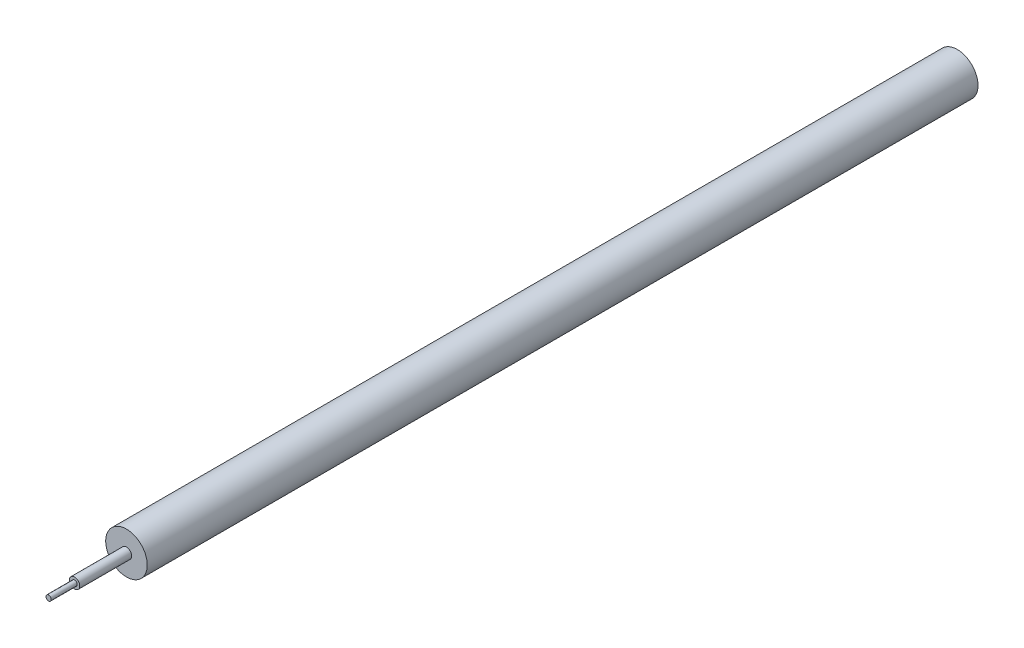
ISO-10303-21;
HEADER;
FILE_DESCRIPTION(('STEP AP214'),'2;1');
FILE_NAME('part.step','',(''),(''),'','','');
FILE_SCHEMA(('AUTOMOTIVE_DESIGN { 1 0 10303 214 1 1 1 1 }'));
ENDSEC;
DATA;
#1=APPLICATION_CONTEXT('core data for automotive mechanical design processes');
#2=APPLICATION_PROTOCOL_DEFINITION('international standard','automotive_design',2000,#1);
#3=PRODUCT_CONTEXT('',#1,'mechanical');
#4=PRODUCT('Part','Part','',(#3));
#5=PRODUCT_RELATED_PRODUCT_CATEGORY('part','',(#4));
#6=PRODUCT_DEFINITION_FORMATION('','',#4);
#7=PRODUCT_DEFINITION_CONTEXT('part definition',#1,'design');
#8=PRODUCT_DEFINITION('design','',#6,#7);
#9=PRODUCT_DEFINITION_SHAPE('','',#8);
#10=(LENGTH_UNIT() NAMED_UNIT(*) SI_UNIT(.MILLI.,.METRE.));
#11=(NAMED_UNIT(*) PLANE_ANGLE_UNIT() SI_UNIT($,.RADIAN.));
#12=(NAMED_UNIT(*) SI_UNIT($,.STERADIAN.) SOLID_ANGLE_UNIT());
#13=UNCERTAINTY_MEASURE_WITH_UNIT(LENGTH_MEASURE(1.E-05),#10,'distance_accuracy_value','');
#14=(GEOMETRIC_REPRESENTATION_CONTEXT(3) GLOBAL_UNCERTAINTY_ASSIGNED_CONTEXT((#13)) GLOBAL_UNIT_ASSIGNED_CONTEXT((#10,
#11,#12)) REPRESENTATION_CONTEXT('',''));
#15=CARTESIAN_POINT('',(0.,0.,0.));
#16=DIRECTION('',(0.,0.,1.));
#17=DIRECTION('',(1.,0.,0.));
#18=AXIS2_PLACEMENT_3D('',#15,#16,#17);
#19=CARTESIAN_POINT('',(4.9960036108132E-13,4.8017145815038E-12,160.));
#20=DIRECTION('',(0.,0.,-1.));
#21=DIRECTION('',(-1.00000000000004,0.,0.));
#22=AXIS2_PLACEMENT_3D('',#19,#20,#21);
#23=CYLINDRICAL_SURFACE('',#22,4.);
#24=CARTESIAN_POINT('',(4.9960036108132E-13,4.8017145815038E-12,160.));
#25=DIRECTION('',(0.,0.,1.));
#26=DIRECTION('',(1.00000000000004,0.,0.));
#27=AXIS2_PLACEMENT_3D('',#24,#25,#26);
#28=CIRCLE('',#27,4.);
#29=CARTESIAN_POINT('',(4.00000000000065,4.80201989283557E-12,160.));
#30=VERTEX_POINT('',#29);
#31=EDGE_CURVE('E72',#30,#30,#28,.T.);
#32=ORIENTED_EDGE('',*,*,#31,.F.);
#33=EDGE_LOOP('',(#32));
#34=FACE_BOUND('',#33,.T.);
#35=CARTESIAN_POINT('',(0.,0.,0.));
#36=DIRECTION('',(0.,0.,1.));
#37=DIRECTION('',(1.00000000000004,0.,0.));
#38=AXIS2_PLACEMENT_3D('',#35,#36,#37);
#39=CIRCLE('',#38,4.);
#40=CARTESIAN_POINT('',(4.00000000000015,0.,0.));
#41=VERTEX_POINT('',#40);
#42=EDGE_CURVE('E77',#41,#41,#39,.T.);
#43=ORIENTED_EDGE('',*,*,#42,.T.);
#44=EDGE_LOOP('',(#43));
#45=FACE_BOUND('',#44,.T.);
#46=ADVANCED_FACE('F65',(#34,#45),#23,.T.);
#47=CARTESIAN_POINT('',(4.9960036108132E-13,4.8017145815038E-12,160.));
#48=DIRECTION('',(0.,0.,1.));
#49=DIRECTION('',(1.00000000000004,0.,0.));
#50=AXIS2_PLACEMENT_3D('',#47,#48,#49);
#51=PLANE('',#50);
#52=CARTESIAN_POINT('',(4.9960036108132E-13,4.8017145815038E-12,160.));
#53=DIRECTION('',(0.,0.,1.));
#54=DIRECTION('',(1.00000000000004,0.,0.));
#55=AXIS2_PLACEMENT_3D('',#52,#53,#54);
#56=CIRCLE('',#55,1.);
#57=CARTESIAN_POINT('',(1.00000000000054,4.80179090933675E-12,160.));
#58=VERTEX_POINT('',#57);
#59=EDGE_CURVE('E13',#58,#58,#56,.T.);
#60=ORIENTED_EDGE('',*,*,#59,.F.);
#61=EDGE_LOOP('',(#60));
#62=FACE_BOUND('',#61,.T.);
#63=ORIENTED_EDGE('',*,*,#31,.T.);
#64=EDGE_LOOP('',(#63));
#65=FACE_BOUND('',#64,.T.);
#66=ADVANCED_FACE('F110',(#62,#65),#51,.T.);
#67=CARTESIAN_POINT('',(0.,0.,0.));
#68=DIRECTION('',(0.,0.,1.));
#69=DIRECTION('',(1.00000000000004,0.,0.));
#70=AXIS2_PLACEMENT_3D('',#67,#68,#69);
#71=PLANE('',#70);
#72=ORIENTED_EDGE('',*,*,#42,.F.);
#73=EDGE_LOOP('',(#72));
#74=FACE_BOUND('',#73,.T.);
#75=ADVANCED_FACE('F115',(#74),#71,.F.);
#76=CARTESIAN_POINT('',(1.64798730217797E-13,0.,170.));
#77=DIRECTION('',(0.,0.,-1.));
#78=DIRECTION('',(-1.00000000000004,0.,0.));
#79=AXIS2_PLACEMENT_3D('',#76,#77,#78);
#80=CYLINDRICAL_SURFACE('',#79,1.);
#81=CARTESIAN_POINT('',(1.64798730217797E-13,0.,170.));
#82=DIRECTION('',(0.,0.,1.));
#83=DIRECTION('',(1.00000000000004,0.,0.));
#84=AXIS2_PLACEMENT_3D('',#81,#82,#83);
#85=CIRCLE('',#84,1.);
#86=CARTESIAN_POINT('',(1.0000000000002,0.,170.));
#87=VERTEX_POINT('',#86);
#88=EDGE_CURVE('E80',#87,#87,#85,.T.);
#89=ORIENTED_EDGE('',*,*,#88,.F.);
#90=EDGE_LOOP('',(#89));
#91=FACE_BOUND('',#90,.T.);
#92=ORIENTED_EDGE('',*,*,#59,.T.);
#93=EDGE_LOOP('',(#92));
#94=FACE_BOUND('',#93,.T.);
#95=ADVANCED_FACE('F107',(#91,#94),#80,.T.);
#96=CARTESIAN_POINT('',(1.64798730217797E-13,0.,170.));
#97=DIRECTION('',(0.,0.,1.));
#98=DIRECTION('',(1.00000000000004,0.,0.));
#99=AXIS2_PLACEMENT_3D('',#96,#97,#98);
#100=PLANE('',#99);
#101=CARTESIAN_POINT('',(1.64798730217797E-13,0.,170.));
#102=DIRECTION('',(0.,0.,1.));
#103=DIRECTION('',(1.00000000000004,0.,0.));
#104=AXIS2_PLACEMENT_3D('',#101,#102,#103);
#105=CIRCLE('',#104,0.5);
#106=CARTESIAN_POINT('',(0.500000000000183,0.,170.));
#107=VERTEX_POINT('',#106);
#108=EDGE_CURVE('E68',#107,#107,#105,.F.);
#109=ORIENTED_EDGE('',*,*,#108,.T.);
#110=EDGE_LOOP('',(#109));
#111=FACE_BOUND('',#110,.T.);
#112=ORIENTED_EDGE('',*,*,#88,.T.);
#113=EDGE_LOOP('',(#112));
#114=FACE_BOUND('',#113,.T.);
#115=ADVANCED_FACE('F99',(#111,#114),#100,.T.);
#116=CARTESIAN_POINT('',(-1.09287578986539E-13,2.77555756156289E-13,175.));
#117=DIRECTION('',(0.,0.,-1.));
#118=DIRECTION('',(-1.00000000000004,0.,0.));
#119=AXIS2_PLACEMENT_3D('',#116,#117,#118);
#120=CYLINDRICAL_SURFACE('',#119,0.5);
#121=ORIENTED_EDGE('',*,*,#108,.F.);
#122=EDGE_LOOP('',(#121));
#123=FACE_BOUND('',#122,.T.);
#124=CARTESIAN_POINT('',(-1.09287578986539E-13,2.77555756156289E-13,175.));
#125=DIRECTION('',(0.,0.,1.));
#126=DIRECTION('',(1.00000000000004,0.,0.));
#127=AXIS2_PLACEMENT_3D('',#124,#125,#126);
#128=CIRCLE('',#127,0.5);
#129=CARTESIAN_POINT('',(0.499999999999909,2.77593920072761E-13,175.));
#130=VERTEX_POINT('',#129);
#131=EDGE_CURVE('E89',#130,#130,#128,.T.);
#132=ORIENTED_EDGE('',*,*,#131,.F.);
#133=EDGE_LOOP('',(#132));
#134=FACE_BOUND('',#133,.T.);
#135=ADVANCED_FACE('F97',(#123,#134),#120,.T.);
#136=CARTESIAN_POINT('',(-1.09287578986539E-13,2.77555756156289E-13,175.));
#137=DIRECTION('',(0.,0.,1.));
#138=DIRECTION('',(1.00000000000004,0.,0.));
#139=AXIS2_PLACEMENT_3D('',#136,#137,#138);
#140=PLANE('',#139);
#141=ORIENTED_EDGE('',*,*,#131,.T.);
#142=EDGE_LOOP('',(#141));
#143=FACE_BOUND('',#142,.T.);
#144=ADVANCED_FACE('F95',(#143),#140,.T.);
#145=CLOSED_SHELL('',(#46,#66,#75,#95,#115,#135,#144));
#146=MANIFOLD_SOLID_BREP('B2',#145);
#147=ADVANCED_BREP_SHAPE_REPRESENTATION('',(#18,#146),#14);
#148=SHAPE_DEFINITION_REPRESENTATION(#9,#147);
ENDSEC;
END-ISO-10303-21;
